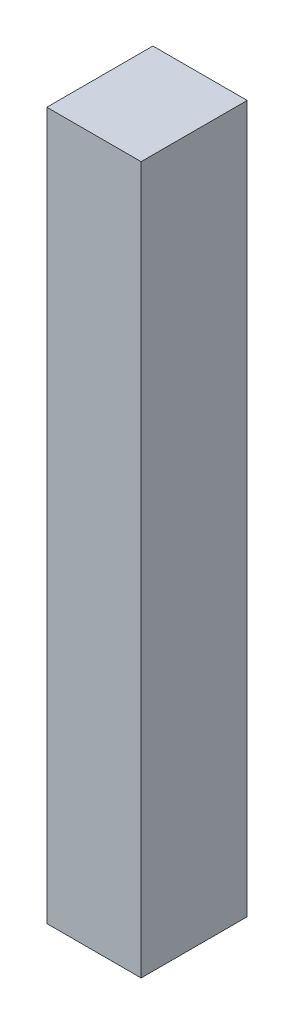
ISO-10303-21;
HEADER;
FILE_DESCRIPTION(('STEP AP214'),'2;1');
FILE_NAME('part.step','',(''),(''),'','','');
FILE_SCHEMA(('AUTOMOTIVE_DESIGN { 1 0 10303 214 1 1 1 1 }'));
ENDSEC;
DATA;
#1=APPLICATION_CONTEXT('core data for automotive mechanical design processes');
#2=APPLICATION_PROTOCOL_DEFINITION('international standard','automotive_design',2000,#1);
#3=PRODUCT_CONTEXT('',#1,'mechanical');
#4=PRODUCT('Part','Part','',(#3));
#5=PRODUCT_RELATED_PRODUCT_CATEGORY('part','',(#4));
#6=PRODUCT_DEFINITION_FORMATION('','',#4);
#7=PRODUCT_DEFINITION_CONTEXT('part definition',#1,'design');
#8=PRODUCT_DEFINITION('design','',#6,#7);
#9=PRODUCT_DEFINITION_SHAPE('','',#8);
#10=(LENGTH_UNIT() NAMED_UNIT(*) SI_UNIT(.MILLI.,.METRE.));
#11=(NAMED_UNIT(*) PLANE_ANGLE_UNIT() SI_UNIT($,.RADIAN.));
#12=(NAMED_UNIT(*) SI_UNIT($,.STERADIAN.) SOLID_ANGLE_UNIT());
#13=UNCERTAINTY_MEASURE_WITH_UNIT(LENGTH_MEASURE(1.E-05),#10,'distance_accuracy_value','');
#14=(GEOMETRIC_REPRESENTATION_CONTEXT(3) GLOBAL_UNCERTAINTY_ASSIGNED_CONTEXT((#13)) GLOBAL_UNIT_ASSIGNED_CONTEXT((#10,
#11,#12)) REPRESENTATION_CONTEXT('',''));
#15=CARTESIAN_POINT('',(0.,0.,0.));
#16=DIRECTION('',(0.,0.,1.));
#17=DIRECTION('',(1.,0.,0.));
#18=AXIS2_PLACEMENT_3D('',#15,#16,#17);
#19=CARTESIAN_POINT('',(-20.,300.,22.5));
#20=DIRECTION('',(1.,0.,0.));
#21=DIRECTION('',(0.,0.,-1.));
#22=AXIS2_PLACEMENT_3D('',#19,#20,#21);
#23=PLANE('',#22);
#24=DIRECTION('',(0.,0.,1.));
#25=VECTOR('',#24,1.);
#26=CARTESIAN_POINT('',(-20.,0.,22.5));
#27=LINE('',#26,#25);
#28=CARTESIAN_POINT('',(-20.,0.,-22.5));
#29=VERTEX_POINT('',#28);
#30=CARTESIAN_POINT('',(-20.,0.,22.5));
#31=VERTEX_POINT('',#30);
#32=EDGE_CURVE('E111',#29,#31,#27,.T.);
#33=ORIENTED_EDGE('',*,*,#32,.T.);
#34=DIRECTION('',(0.,-1.,0.));
#35=VECTOR('',#34,1.);
#36=CARTESIAN_POINT('',(-20.,300.,22.5));
#37=LINE('',#36,#35);
#38=CARTESIAN_POINT('',(-20.,300.,22.5));
#39=VERTEX_POINT('',#38);
#40=EDGE_CURVE('E11',#39,#31,#37,.T.);
#41=ORIENTED_EDGE('',*,*,#40,.F.);
#42=DIRECTION('',(0.,0.,1.));
#43=VECTOR('',#42,1.);
#44=CARTESIAN_POINT('',(-20.,300.,22.5));
#45=LINE('',#44,#43);
#46=CARTESIAN_POINT('',(-20.,300.,-22.5));
#47=VERTEX_POINT('',#46);
#48=EDGE_CURVE('E95',#47,#39,#45,.T.);
#49=ORIENTED_EDGE('',*,*,#48,.F.);
#50=DIRECTION('',(0.,-1.,0.));
#51=VECTOR('',#50,1.);
#52=CARTESIAN_POINT('',(-20.,300.,-22.5));
#53=LINE('',#52,#51);
#54=EDGE_CURVE('E107',#47,#29,#53,.T.);
#55=ORIENTED_EDGE('',*,*,#54,.T.);
#56=EDGE_LOOP('',(#33,#41,#49,#55));
#57=FACE_BOUND('',#56,.T.);
#58=ADVANCED_FACE('F43',(#57),#23,.F.);
#59=CARTESIAN_POINT('',(20.,300.,22.5));
#60=DIRECTION('',(0.,0.,-1.));
#61=DIRECTION('',(-1.,0.,0.));
#62=AXIS2_PLACEMENT_3D('',#59,#60,#61);
#63=PLANE('',#62);
#64=DIRECTION('',(1.,0.,0.));
#65=VECTOR('',#64,1.);
#66=CARTESIAN_POINT('',(20.,0.,22.5));
#67=LINE('',#66,#65);
#68=CARTESIAN_POINT('',(20.,0.,22.5));
#69=VERTEX_POINT('',#68);
#70=EDGE_CURVE('E100',#31,#69,#67,.T.);
#71=ORIENTED_EDGE('',*,*,#70,.T.);
#72=DIRECTION('',(0.,-1.,0.));
#73=VECTOR('',#72,1.);
#74=CARTESIAN_POINT('',(20.,300.,22.5));
#75=LINE('',#74,#73);
#76=CARTESIAN_POINT('',(20.,300.,22.5));
#77=VERTEX_POINT('',#76);
#78=EDGE_CURVE('E52',#77,#69,#75,.T.);
#79=ORIENTED_EDGE('',*,*,#78,.F.);
#80=DIRECTION('',(1.,0.,0.));
#81=VECTOR('',#80,1.);
#82=CARTESIAN_POINT('',(20.,300.,22.5));
#83=LINE('',#82,#81);
#84=EDGE_CURVE('E90',#39,#77,#83,.T.);
#85=ORIENTED_EDGE('',*,*,#84,.F.);
#86=ORIENTED_EDGE('',*,*,#40,.T.);
#87=EDGE_LOOP('',(#71,#79,#85,#86));
#88=FACE_BOUND('',#87,.T.);
#89=ADVANCED_FACE('F99',(#88),#63,.F.);
#90=CARTESIAN_POINT('',(20.,300.,22.5));
#91=DIRECTION('',(-1.,0.,0.));
#92=DIRECTION('',(0.,0.,1.));
#93=AXIS2_PLACEMENT_3D('',#90,#91,#92);
#94=PLANE('',#93);
#95=DIRECTION('',(0.,0.,-1.));
#96=VECTOR('',#95,1.);
#97=CARTESIAN_POINT('',(20.,0.,22.5));
#98=LINE('',#97,#96);
#99=CARTESIAN_POINT('',(20.,0.,-22.5));
#100=VERTEX_POINT('',#99);
#101=EDGE_CURVE('E77',#69,#100,#98,.T.);
#102=ORIENTED_EDGE('',*,*,#101,.T.);
#103=DIRECTION('',(0.,-1.,0.));
#104=VECTOR('',#103,1.);
#105=CARTESIAN_POINT('',(20.,300.,-22.5));
#106=LINE('',#105,#104);
#107=CARTESIAN_POINT('',(20.,300.,-22.5));
#108=VERTEX_POINT('',#107);
#109=EDGE_CURVE('E102',#108,#100,#106,.T.);
#110=ORIENTED_EDGE('',*,*,#109,.F.);
#111=DIRECTION('',(0.,0.,-1.));
#112=VECTOR('',#111,1.);
#113=CARTESIAN_POINT('',(20.,300.,22.5));
#114=LINE('',#113,#112);
#115=EDGE_CURVE('E93',#77,#108,#114,.T.);
#116=ORIENTED_EDGE('',*,*,#115,.F.);
#117=ORIENTED_EDGE('',*,*,#78,.T.);
#118=EDGE_LOOP('',(#102,#110,#116,#117));
#119=FACE_BOUND('',#118,.T.);
#120=ADVANCED_FACE('F103',(#119),#94,.F.);
#121=CARTESIAN_POINT('',(20.,300.,-22.5));
#122=DIRECTION('',(0.,0.,1.));
#123=DIRECTION('',(1.,0.,0.));
#124=AXIS2_PLACEMENT_3D('',#121,#122,#123);
#125=PLANE('',#124);
#126=DIRECTION('',(-1.,0.,0.));
#127=VECTOR('',#126,1.);
#128=CARTESIAN_POINT('',(20.,0.,-22.5));
#129=LINE('',#128,#127);
#130=EDGE_CURVE('E83',#100,#29,#129,.T.);
#131=ORIENTED_EDGE('',*,*,#130,.T.);
#132=ORIENTED_EDGE('',*,*,#54,.F.);
#133=DIRECTION('',(-1.,0.,0.));
#134=VECTOR('',#133,1.);
#135=CARTESIAN_POINT('',(20.,300.,-22.5));
#136=LINE('',#135,#134);
#137=EDGE_CURVE('E60',#108,#47,#136,.T.);
#138=ORIENTED_EDGE('',*,*,#137,.F.);
#139=ORIENTED_EDGE('',*,*,#109,.T.);
#140=EDGE_LOOP('',(#131,#132,#138,#139));
#141=FACE_BOUND('',#140,.T.);
#142=ADVANCED_FACE('F124',(#141),#125,.F.);
#143=CARTESIAN_POINT('',(0.,300.,0.));
#144=DIRECTION('',(0.,1.,0.));
#145=DIRECTION('',(0.,0.,1.));
#146=AXIS2_PLACEMENT_3D('',#143,#144,#145);
#147=PLANE('',#146);
#148=ORIENTED_EDGE('',*,*,#48,.T.);
#149=ORIENTED_EDGE('',*,*,#84,.T.);
#150=ORIENTED_EDGE('',*,*,#115,.T.);
#151=ORIENTED_EDGE('',*,*,#137,.T.);
#152=EDGE_LOOP('',(#148,#149,#150,#151));
#153=FACE_BOUND('',#152,.T.);
#154=ADVANCED_FACE('F91',(#153),#147,.T.);
#155=CARTESIAN_POINT('',(0.,0.,0.));
#156=DIRECTION('',(0.,1.,0.));
#157=DIRECTION('',(0.,0.,1.));
#158=AXIS2_PLACEMENT_3D('',#155,#156,#157);
#159=PLANE('',#158);
#160=ORIENTED_EDGE('',*,*,#32,.F.);
#161=ORIENTED_EDGE('',*,*,#130,.F.);
#162=ORIENTED_EDGE('',*,*,#101,.F.);
#163=ORIENTED_EDGE('',*,*,#70,.F.);
#164=EDGE_LOOP('',(#160,#161,#162,#163));
#165=FACE_BOUND('',#164,.T.);
#166=ADVANCED_FACE('F127',(#165),#159,.F.);
#167=CLOSED_SHELL('',(#58,#89,#120,#142,#154,#166));
#168=MANIFOLD_SOLID_BREP('B2',#167);
#169=ADVANCED_BREP_SHAPE_REPRESENTATION('',(#18,#168),#14);
#170=SHAPE_DEFINITION_REPRESENTATION(#9,#169);
ENDSEC;
END-ISO-10303-21;
